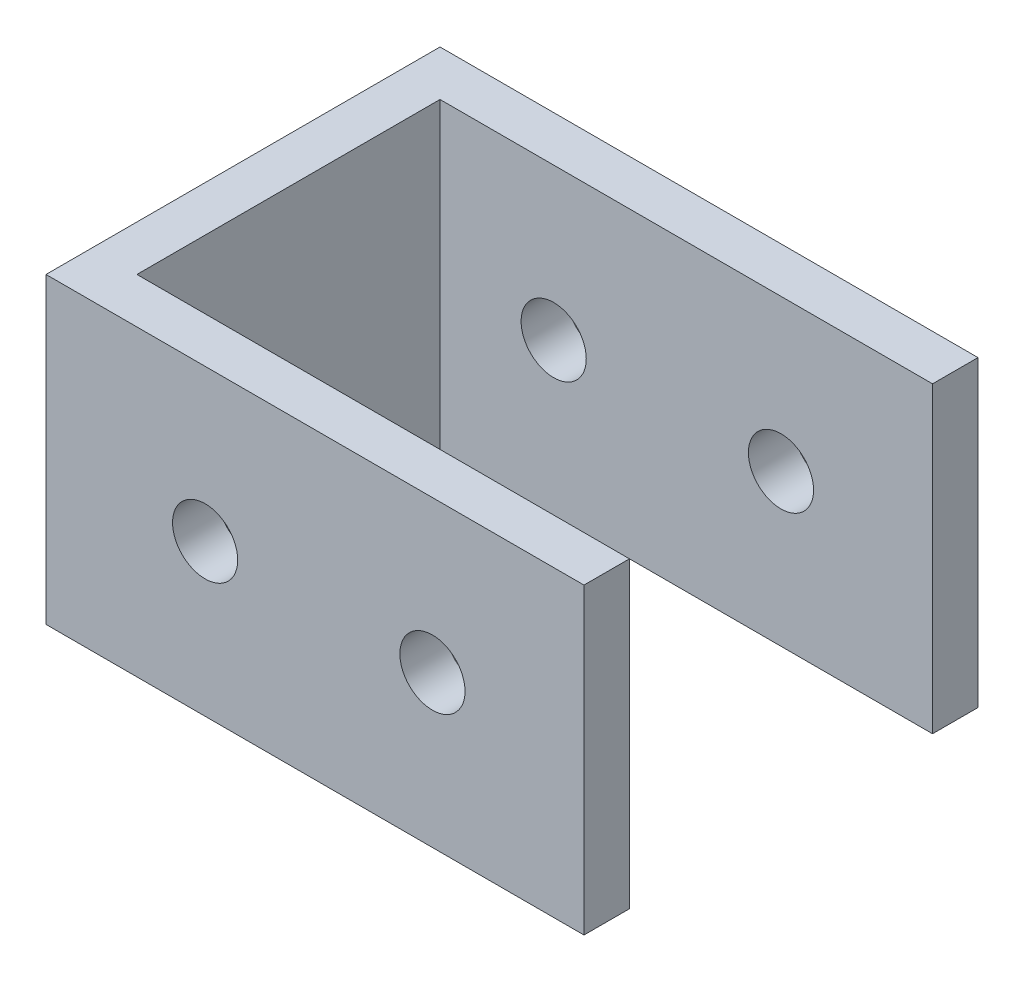
ISO-10303-21;
HEADER;
FILE_DESCRIPTION(('STEP AP214'),'2;1');
FILE_NAME('part.step','',(''),(''),'','','');
FILE_SCHEMA(('AUTOMOTIVE_DESIGN { 1 0 10303 214 1 1 1 1 }'));
ENDSEC;
DATA;
#1=APPLICATION_CONTEXT('core data for automotive mechanical design processes');
#2=APPLICATION_PROTOCOL_DEFINITION('international standard','automotive_design',2000,#1);
#3=PRODUCT_CONTEXT('',#1,'mechanical');
#4=PRODUCT('Part','Part','',(#3));
#5=PRODUCT_RELATED_PRODUCT_CATEGORY('part','',(#4));
#6=PRODUCT_DEFINITION_FORMATION('','',#4);
#7=PRODUCT_DEFINITION_CONTEXT('part definition',#1,'design');
#8=PRODUCT_DEFINITION('design','',#6,#7);
#9=PRODUCT_DEFINITION_SHAPE('','',#8);
#10=(LENGTH_UNIT() NAMED_UNIT(*) SI_UNIT(.MILLI.,.METRE.));
#11=(NAMED_UNIT(*) PLANE_ANGLE_UNIT() SI_UNIT($,.RADIAN.));
#12=(NAMED_UNIT(*) SI_UNIT($,.STERADIAN.) SOLID_ANGLE_UNIT());
#13=UNCERTAINTY_MEASURE_WITH_UNIT(LENGTH_MEASURE(1.E-05),#10,'distance_accuracy_value','');
#14=(GEOMETRIC_REPRESENTATION_CONTEXT(3) GLOBAL_UNCERTAINTY_ASSIGNED_CONTEXT((#13)) GLOBAL_UNIT_ASSIGNED_CONTEXT((#10,
#11,#12)) REPRESENTATION_CONTEXT('',''));
#15=CARTESIAN_POINT('',(0.,0.,0.));
#16=DIRECTION('',(0.,0.,1.));
#17=DIRECTION('',(1.,0.,0.));
#18=AXIS2_PLACEMENT_3D('',#15,#16,#17);
#19=CARTESIAN_POINT('',(0.,20.,0.));
#20=DIRECTION('',(1.,0.,0.));
#21=DIRECTION('',(0.,0.,-1.));
#22=AXIS2_PLACEMENT_3D('',#19,#20,#21);
#23=PLANE('',#22);
#24=DIRECTION('',(0.,0.,1.));
#25=VECTOR('',#24,1.);
#26=CARTESIAN_POINT('',(0.,0.,0.));
#27=LINE('',#26,#25);
#28=CARTESIAN_POINT('',(0.,0.,-26.));
#29=VERTEX_POINT('',#28);
#30=CARTESIAN_POINT('',(0.,0.,0.));
#31=VERTEX_POINT('',#30);
#32=EDGE_CURVE('E131',#29,#31,#27,.T.);
#33=ORIENTED_EDGE('',*,*,#32,.T.);
#34=DIRECTION('',(0.,-1.,0.));
#35=VECTOR('',#34,1.);
#36=CARTESIAN_POINT('',(0.,20.,0.));
#37=LINE('',#36,#35);
#38=CARTESIAN_POINT('',(0.,20.,0.));
#39=VERTEX_POINT('',#38);
#40=EDGE_CURVE('E11',#39,#31,#37,.T.);
#41=ORIENTED_EDGE('',*,*,#40,.F.);
#42=DIRECTION('',(0.,0.,1.));
#43=VECTOR('',#42,1.);
#44=CARTESIAN_POINT('',(0.,20.,0.));
#45=LINE('',#44,#43);
#46=CARTESIAN_POINT('',(0.,20.,-26.));
#47=VERTEX_POINT('',#46);
#48=EDGE_CURVE('E146',#47,#39,#45,.T.);
#49=ORIENTED_EDGE('',*,*,#48,.F.);
#50=DIRECTION('',(0.,-1.,0.));
#51=VECTOR('',#50,1.);
#52=CARTESIAN_POINT('',(0.,20.,-26.));
#53=LINE('',#52,#51);
#54=EDGE_CURVE('E127',#47,#29,#53,.T.);
#55=ORIENTED_EDGE('',*,*,#54,.T.);
#56=EDGE_LOOP('',(#33,#41,#49,#55));
#57=FACE_BOUND('',#56,.T.);
#58=ADVANCED_FACE('F35',(#57),#23,.F.);
#59=CARTESIAN_POINT('',(0.,20.,0.));
#60=DIRECTION('',(0.,0.,-1.));
#61=DIRECTION('',(-1.,0.,0.));
#62=AXIS2_PLACEMENT_3D('',#59,#60,#61);
#63=PLANE('',#62);
#64=CARTESIAN_POINT('',(10.5,10.,0.));
#65=DIRECTION('',(0.,0.,1.));
#66=DIRECTION('',(1.,0.,0.));
#67=AXIS2_PLACEMENT_3D('',#64,#65,#66);
#68=CIRCLE('',#67,2.15);
#69=CARTESIAN_POINT('',(12.65,10.,0.));
#70=VERTEX_POINT('',#69);
#71=EDGE_CURVE('E197',#70,#70,#68,.T.);
#72=ORIENTED_EDGE('',*,*,#71,.F.);
#73=EDGE_LOOP('',(#72));
#74=FACE_BOUND('',#73,.T.);
#75=CARTESIAN_POINT('',(25.5,10.,0.));
#76=DIRECTION('',(0.,0.,1.));
#77=DIRECTION('',(1.,0.,0.));
#78=AXIS2_PLACEMENT_3D('',#75,#76,#77);
#79=CIRCLE('',#78,2.15);
#80=CARTESIAN_POINT('',(27.65,10.,0.));
#81=VERTEX_POINT('',#80);
#82=EDGE_CURVE('E191',#81,#81,#79,.T.);
#83=ORIENTED_EDGE('',*,*,#82,.F.);
#84=EDGE_LOOP('',(#83));
#85=FACE_BOUND('',#84,.T.);
#86=DIRECTION('',(1.,0.,0.));
#87=VECTOR('',#86,1.);
#88=CARTESIAN_POINT('',(0.,0.,0.));
#89=LINE('',#88,#87);
#90=CARTESIAN_POINT('',(35.5,0.,0.));
#91=VERTEX_POINT('',#90);
#92=EDGE_CURVE('E134',#31,#91,#89,.T.);
#93=ORIENTED_EDGE('',*,*,#92,.T.);
#94=DIRECTION('',(0.,-1.,0.));
#95=VECTOR('',#94,1.);
#96=CARTESIAN_POINT('',(35.5,20.,0.));
#97=LINE('',#96,#95);
#98=CARTESIAN_POINT('',(35.5,20.,0.));
#99=VERTEX_POINT('',#98);
#100=EDGE_CURVE('E43',#99,#91,#97,.T.);
#101=ORIENTED_EDGE('',*,*,#100,.F.);
#102=DIRECTION('',(1.,0.,0.));
#103=VECTOR('',#102,1.);
#104=CARTESIAN_POINT('',(0.,20.,0.));
#105=LINE('',#104,#103);
#106=EDGE_CURVE('E94',#39,#99,#105,.T.);
#107=ORIENTED_EDGE('',*,*,#106,.F.);
#108=ORIENTED_EDGE('',*,*,#40,.T.);
#109=EDGE_LOOP('',(#93,#101,#107,#108));
#110=FACE_BOUND('',#109,.T.);
#111=ADVANCED_FACE('F232',(#74,#85,#110),#63,.F.);
#112=CARTESIAN_POINT('',(35.5,20.,0.));
#113=DIRECTION('',(-1.,0.,0.));
#114=DIRECTION('',(0.,0.,1.));
#115=AXIS2_PLACEMENT_3D('',#112,#113,#114);
#116=PLANE('',#115);
#117=DIRECTION('',(0.,0.,-1.));
#118=VECTOR('',#117,1.);
#119=CARTESIAN_POINT('',(35.5,0.,0.));
#120=LINE('',#119,#118);
#121=CARTESIAN_POINT('',(35.5,0.,-3.00000000000001));
#122=VERTEX_POINT('',#121);
#123=EDGE_CURVE('E137',#91,#122,#120,.T.);
#124=ORIENTED_EDGE('',*,*,#123,.T.);
#125=DIRECTION('',(0.,-1.,0.));
#126=VECTOR('',#125,1.);
#127=CARTESIAN_POINT('',(35.5,20.,-3.00000000000001));
#128=LINE('',#127,#126);
#129=CARTESIAN_POINT('',(35.5,20.,-3.00000000000001));
#130=VERTEX_POINT('',#129);
#131=EDGE_CURVE('E153',#130,#122,#128,.T.);
#132=ORIENTED_EDGE('',*,*,#131,.F.);
#133=DIRECTION('',(0.,0.,-1.));
#134=VECTOR('',#133,1.);
#135=CARTESIAN_POINT('',(35.5,20.,0.));
#136=LINE('',#135,#134);
#137=EDGE_CURVE('E161',#99,#130,#136,.T.);
#138=ORIENTED_EDGE('',*,*,#137,.F.);
#139=ORIENTED_EDGE('',*,*,#100,.T.);
#140=EDGE_LOOP('',(#124,#132,#138,#139));
#141=FACE_BOUND('',#140,.T.);
#142=ADVANCED_FACE('F159',(#141),#116,.F.);
#143=CARTESIAN_POINT('',(35.5,20.,-3.00000000000001));
#144=DIRECTION('',(0.,0.,1.));
#145=DIRECTION('',(1.,0.,0.));
#146=AXIS2_PLACEMENT_3D('',#143,#144,#145);
#147=PLANE('',#146);
#148=CARTESIAN_POINT('',(10.5,10.,-3.));
#149=DIRECTION('',(0.,0.,1.));
#150=DIRECTION('',(1.,0.,0.));
#151=AXIS2_PLACEMENT_3D('',#148,#149,#150);
#152=CIRCLE('',#151,2.15);
#153=CARTESIAN_POINT('',(12.65,10.,-3.));
#154=VERTEX_POINT('',#153);
#155=EDGE_CURVE('E135',#154,#154,#152,.T.);
#156=ORIENTED_EDGE('',*,*,#155,.T.);
#157=EDGE_LOOP('',(#156));
#158=FACE_BOUND('',#157,.T.);
#159=CARTESIAN_POINT('',(25.5,10.,-3.00000000000001));
#160=DIRECTION('',(0.,0.,1.));
#161=DIRECTION('',(1.,0.,0.));
#162=AXIS2_PLACEMENT_3D('',#159,#160,#161);
#163=CIRCLE('',#162,2.15);
#164=CARTESIAN_POINT('',(27.65,10.,-3.00000000000001));
#165=VERTEX_POINT('',#164);
#166=EDGE_CURVE('E184',#165,#165,#163,.T.);
#167=ORIENTED_EDGE('',*,*,#166,.T.);
#168=EDGE_LOOP('',(#167));
#169=FACE_BOUND('',#168,.T.);
#170=DIRECTION('',(-1.,0.,0.));
#171=VECTOR('',#170,1.);
#172=CARTESIAN_POINT('',(35.5,0.,-3.00000000000001));
#173=LINE('',#172,#171);
#174=CARTESIAN_POINT('',(3.,0.,-3.));
#175=VERTEX_POINT('',#174);
#176=EDGE_CURVE('E139',#122,#175,#173,.T.);
#177=ORIENTED_EDGE('',*,*,#176,.T.);
#178=DIRECTION('',(0.,-1.,0.));
#179=VECTOR('',#178,1.);
#180=CARTESIAN_POINT('',(3.,20.,-3.));
#181=LINE('',#180,#179);
#182=CARTESIAN_POINT('',(3.,20.,-3.));
#183=VERTEX_POINT('',#182);
#184=EDGE_CURVE('E150',#183,#175,#181,.T.);
#185=ORIENTED_EDGE('',*,*,#184,.F.);
#186=DIRECTION('',(-1.,0.,0.));
#187=VECTOR('',#186,1.);
#188=CARTESIAN_POINT('',(35.5,20.,-3.00000000000001));
#189=LINE('',#188,#187);
#190=EDGE_CURVE('E173',#130,#183,#189,.T.);
#191=ORIENTED_EDGE('',*,*,#190,.F.);
#192=ORIENTED_EDGE('',*,*,#131,.T.);
#193=EDGE_LOOP('',(#177,#185,#191,#192));
#194=FACE_BOUND('',#193,.T.);
#195=ADVANCED_FACE('F169',(#158,#169,#194),#147,.F.);
#196=CARTESIAN_POINT('',(3.,20.,-23.));
#197=DIRECTION('',(-1.,0.,0.));
#198=DIRECTION('',(0.,0.,1.));
#199=AXIS2_PLACEMENT_3D('',#196,#197,#198);
#200=PLANE('',#199);
#201=DIRECTION('',(0.,0.,-1.));
#202=VECTOR('',#201,1.);
#203=CARTESIAN_POINT('',(3.,0.,-23.));
#204=LINE('',#203,#202);
#205=CARTESIAN_POINT('',(3.,0.,-23.));
#206=VERTEX_POINT('',#205);
#207=EDGE_CURVE('E141',#175,#206,#204,.T.);
#208=ORIENTED_EDGE('',*,*,#207,.T.);
#209=DIRECTION('',(0.,-1.,0.));
#210=VECTOR('',#209,1.);
#211=CARTESIAN_POINT('',(3.,20.,-23.));
#212=LINE('',#211,#210);
#213=CARTESIAN_POINT('',(3.,20.,-23.));
#214=VERTEX_POINT('',#213);
#215=EDGE_CURVE('E122',#214,#206,#212,.T.);
#216=ORIENTED_EDGE('',*,*,#215,.F.);
#217=DIRECTION('',(0.,0.,-1.));
#218=VECTOR('',#217,1.);
#219=CARTESIAN_POINT('',(3.,20.,-23.));
#220=LINE('',#219,#218);
#221=EDGE_CURVE('E113',#183,#214,#220,.T.);
#222=ORIENTED_EDGE('',*,*,#221,.F.);
#223=ORIENTED_EDGE('',*,*,#184,.T.);
#224=EDGE_LOOP('',(#208,#216,#222,#223));
#225=FACE_BOUND('',#224,.T.);
#226=ADVANCED_FACE('F172',(#225),#200,.F.);
#227=CARTESIAN_POINT('',(35.5,20.,-23.));
#228=DIRECTION('',(0.,0.,-1.));
#229=DIRECTION('',(-1.,0.,0.));
#230=AXIS2_PLACEMENT_3D('',#227,#228,#229);
#231=PLANE('',#230);
#232=CARTESIAN_POINT('',(10.5,10.,-23.));
#233=DIRECTION('',(0.,0.,-1.));
#234=DIRECTION('',(-1.,0.,0.));
#235=AXIS2_PLACEMENT_3D('',#232,#233,#234);
#236=CIRCLE('',#235,2.15);
#237=CARTESIAN_POINT('',(8.35,10.,-23.));
#238=VERTEX_POINT('',#237);
#239=EDGE_CURVE('E181',#238,#238,#236,.T.);
#240=ORIENTED_EDGE('',*,*,#239,.T.);
#241=EDGE_LOOP('',(#240));
#242=FACE_BOUND('',#241,.T.);
#243=CARTESIAN_POINT('',(25.5,10.,-23.));
#244=DIRECTION('',(0.,0.,-1.));
#245=DIRECTION('',(-1.,0.,0.));
#246=AXIS2_PLACEMENT_3D('',#243,#244,#245);
#247=CIRCLE('',#246,2.15);
#248=CARTESIAN_POINT('',(23.35,10.,-23.));
#249=VERTEX_POINT('',#248);
#250=EDGE_CURVE('E187',#249,#249,#247,.T.);
#251=ORIENTED_EDGE('',*,*,#250,.T.);
#252=EDGE_LOOP('',(#251));
#253=FACE_BOUND('',#252,.T.);
#254=DIRECTION('',(1.,0.,0.));
#255=VECTOR('',#254,1.);
#256=CARTESIAN_POINT('',(35.5,0.,-23.));
#257=LINE('',#256,#255);
#258=CARTESIAN_POINT('',(35.5,0.,-23.));
#259=VERTEX_POINT('',#258);
#260=EDGE_CURVE('E121',#206,#259,#257,.T.);
#261=ORIENTED_EDGE('',*,*,#260,.T.);
#262=DIRECTION('',(0.,-1.,0.));
#263=VECTOR('',#262,1.);
#264=CARTESIAN_POINT('',(35.5,20.,-23.));
#265=LINE('',#264,#263);
#266=CARTESIAN_POINT('',(35.5,20.,-23.));
#267=VERTEX_POINT('',#266);
#268=EDGE_CURVE('E118',#267,#259,#265,.T.);
#269=ORIENTED_EDGE('',*,*,#268,.F.);
#270=DIRECTION('',(1.,0.,0.));
#271=VECTOR('',#270,1.);
#272=CARTESIAN_POINT('',(35.5,20.,-23.));
#273=LINE('',#272,#271);
#274=EDGE_CURVE('E107',#214,#267,#273,.T.);
#275=ORIENTED_EDGE('',*,*,#274,.F.);
#276=ORIENTED_EDGE('',*,*,#215,.T.);
#277=EDGE_LOOP('',(#261,#269,#275,#276));
#278=FACE_BOUND('',#277,.T.);
#279=ADVANCED_FACE('F119',(#242,#253,#278),#231,.F.);
#280=CARTESIAN_POINT('',(35.5,20.,-23.));
#281=DIRECTION('',(-1.,0.,0.));
#282=DIRECTION('',(0.,0.,1.));
#283=AXIS2_PLACEMENT_3D('',#280,#281,#282);
#284=PLANE('',#283);
#285=DIRECTION('',(0.,0.,-1.));
#286=VECTOR('',#285,1.);
#287=CARTESIAN_POINT('',(35.5,0.,-23.));
#288=LINE('',#287,#286);
#289=CARTESIAN_POINT('',(35.5,0.,-26.));
#290=VERTEX_POINT('',#289);
#291=EDGE_CURVE('E80',#259,#290,#288,.T.);
#292=ORIENTED_EDGE('',*,*,#291,.T.);
#293=DIRECTION('',(0.,-1.,0.));
#294=VECTOR('',#293,1.);
#295=CARTESIAN_POINT('',(35.5,20.,-26.));
#296=LINE('',#295,#294);
#297=CARTESIAN_POINT('',(35.5,20.,-26.));
#298=VERTEX_POINT('',#297);
#299=EDGE_CURVE('E123',#298,#290,#296,.T.);
#300=ORIENTED_EDGE('',*,*,#299,.F.);
#301=DIRECTION('',(0.,0.,-1.));
#302=VECTOR('',#301,1.);
#303=CARTESIAN_POINT('',(35.5,20.,-23.));
#304=LINE('',#303,#302);
#305=EDGE_CURVE('E111',#267,#298,#304,.T.);
#306=ORIENTED_EDGE('',*,*,#305,.F.);
#307=ORIENTED_EDGE('',*,*,#268,.T.);
#308=EDGE_LOOP('',(#292,#300,#306,#307));
#309=FACE_BOUND('',#308,.T.);
#310=ADVANCED_FACE('F125',(#309),#284,.F.);
#311=CARTESIAN_POINT('',(0.,20.,-26.));
#312=DIRECTION('',(0.,0.,1.));
#313=DIRECTION('',(1.,0.,0.));
#314=AXIS2_PLACEMENT_3D('',#311,#312,#313);
#315=PLANE('',#314);
#316=CARTESIAN_POINT('',(10.5,10.,-26.));
#317=DIRECTION('',(0.,0.,1.));
#318=DIRECTION('',(1.,0.,0.));
#319=AXIS2_PLACEMENT_3D('',#316,#317,#318);
#320=CIRCLE('',#319,2.15);
#321=CARTESIAN_POINT('',(12.65,10.,-26.));
#322=VERTEX_POINT('',#321);
#323=EDGE_CURVE('E190',#322,#322,#320,.T.);
#324=ORIENTED_EDGE('',*,*,#323,.T.);
#325=EDGE_LOOP('',(#324));
#326=FACE_BOUND('',#325,.T.);
#327=CARTESIAN_POINT('',(25.5,10.,-26.));
#328=DIRECTION('',(0.,0.,1.));
#329=DIRECTION('',(1.,0.,0.));
#330=AXIS2_PLACEMENT_3D('',#327,#328,#329);
#331=CIRCLE('',#330,2.15);
#332=CARTESIAN_POINT('',(27.65,10.,-26.));
#333=VERTEX_POINT('',#332);
#334=EDGE_CURVE('E194',#333,#333,#331,.T.);
#335=ORIENTED_EDGE('',*,*,#334,.T.);
#336=EDGE_LOOP('',(#335));
#337=FACE_BOUND('',#336,.T.);
#338=DIRECTION('',(-1.,0.,0.));
#339=VECTOR('',#338,1.);
#340=CARTESIAN_POINT('',(0.,0.,-26.));
#341=LINE('',#340,#339);
#342=EDGE_CURVE('E86',#290,#29,#341,.T.);
#343=ORIENTED_EDGE('',*,*,#342,.T.);
#344=ORIENTED_EDGE('',*,*,#54,.F.);
#345=DIRECTION('',(-1.,0.,0.));
#346=VECTOR('',#345,1.);
#347=CARTESIAN_POINT('',(0.,20.,-26.));
#348=LINE('',#347,#346);
#349=EDGE_CURVE('E51',#298,#47,#348,.T.);
#350=ORIENTED_EDGE('',*,*,#349,.F.);
#351=ORIENTED_EDGE('',*,*,#299,.T.);
#352=EDGE_LOOP('',(#343,#344,#350,#351));
#353=FACE_BOUND('',#352,.T.);
#354=ADVANCED_FACE('F203',(#326,#337,#353),#315,.F.);
#355=CARTESIAN_POINT('',(0.,20.,0.));
#356=DIRECTION('',(0.,-1.,0.));
#357=DIRECTION('',(0.,0.,-1.));
#358=AXIS2_PLACEMENT_3D('',#355,#356,#357);
#359=PLANE('',#358);
#360=ORIENTED_EDGE('',*,*,#48,.T.);
#361=ORIENTED_EDGE('',*,*,#106,.T.);
#362=ORIENTED_EDGE('',*,*,#137,.T.);
#363=ORIENTED_EDGE('',*,*,#190,.T.);
#364=ORIENTED_EDGE('',*,*,#221,.T.);
#365=ORIENTED_EDGE('',*,*,#274,.T.);
#366=ORIENTED_EDGE('',*,*,#305,.T.);
#367=ORIENTED_EDGE('',*,*,#349,.T.);
#368=EDGE_LOOP('',(#360,#361,#362,#363,#364,#365,#366,#367));
#369=FACE_BOUND('',#368,.T.);
#370=ADVANCED_FACE('F109',(#369),#359,.F.);
#371=CARTESIAN_POINT('',(0.,0.,0.));
#372=DIRECTION('',(0.,-1.,0.));
#373=DIRECTION('',(0.,0.,-1.));
#374=AXIS2_PLACEMENT_3D('',#371,#372,#373);
#375=PLANE('',#374);
#376=ORIENTED_EDGE('',*,*,#32,.F.);
#377=ORIENTED_EDGE('',*,*,#342,.F.);
#378=ORIENTED_EDGE('',*,*,#291,.F.);
#379=ORIENTED_EDGE('',*,*,#260,.F.);
#380=ORIENTED_EDGE('',*,*,#207,.F.);
#381=ORIENTED_EDGE('',*,*,#176,.F.);
#382=ORIENTED_EDGE('',*,*,#123,.F.);
#383=ORIENTED_EDGE('',*,*,#92,.F.);
#384=EDGE_LOOP('',(#376,#377,#378,#379,#380,#381,#382,#383));
#385=FACE_BOUND('',#384,.T.);
#386=ADVANCED_FACE('F165',(#385),#375,.T.);
#387=CARTESIAN_POINT('',(25.5,10.,-26.));
#388=DIRECTION('',(0.,0.,1.));
#389=DIRECTION('',(1.,0.,0.));
#390=AXIS2_PLACEMENT_3D('',#387,#388,#389);
#391=CYLINDRICAL_SURFACE('',#390,2.15);
#392=ORIENTED_EDGE('',*,*,#334,.F.);
#393=EDGE_LOOP('',(#392));
#394=FACE_BOUND('',#393,.T.);
#395=ORIENTED_EDGE('',*,*,#250,.F.);
#396=EDGE_LOOP('',(#395));
#397=FACE_BOUND('',#396,.T.);
#398=ADVANCED_FACE('F210',(#394,#397),#391,.F.);
#399=CARTESIAN_POINT('',(10.5,10.,-26.));
#400=DIRECTION('',(0.,0.,1.));
#401=DIRECTION('',(1.,0.,0.));
#402=AXIS2_PLACEMENT_3D('',#399,#400,#401);
#403=CYLINDRICAL_SURFACE('',#402,2.15);
#404=ORIENTED_EDGE('',*,*,#323,.F.);
#405=EDGE_LOOP('',(#404));
#406=FACE_BOUND('',#405,.T.);
#407=ORIENTED_EDGE('',*,*,#239,.F.);
#408=EDGE_LOOP('',(#407));
#409=FACE_BOUND('',#408,.T.);
#410=ADVANCED_FACE('F206',(#406,#409),#403,.F.);
#411=ORIENTED_EDGE('',*,*,#82,.T.);
#412=EDGE_LOOP('',(#411));
#413=FACE_BOUND('',#412,.T.);
#414=ORIENTED_EDGE('',*,*,#166,.F.);
#415=EDGE_LOOP('',(#414));
#416=FACE_BOUND('',#415,.T.);
#417=ADVANCED_FACE('F209',(#413,#416),#391,.F.);
#418=ORIENTED_EDGE('',*,*,#71,.T.);
#419=EDGE_LOOP('',(#418));
#420=FACE_BOUND('',#419,.T.);
#421=ORIENTED_EDGE('',*,*,#155,.F.);
#422=EDGE_LOOP('',(#421));
#423=FACE_BOUND('',#422,.T.);
#424=ADVANCED_FACE('F212',(#420,#423),#403,.F.);
#425=CLOSED_SHELL('',(#58,#111,#142,#195,#226,#279,#310,#354,#370,#386,#398,#410,#417,#424));
#426=MANIFOLD_SOLID_BREP('B2',#425);
#427=ADVANCED_BREP_SHAPE_REPRESENTATION('',(#18,#426),#14);
#428=SHAPE_DEFINITION_REPRESENTATION(#9,#427);
ENDSEC;
END-ISO-10303-21;
